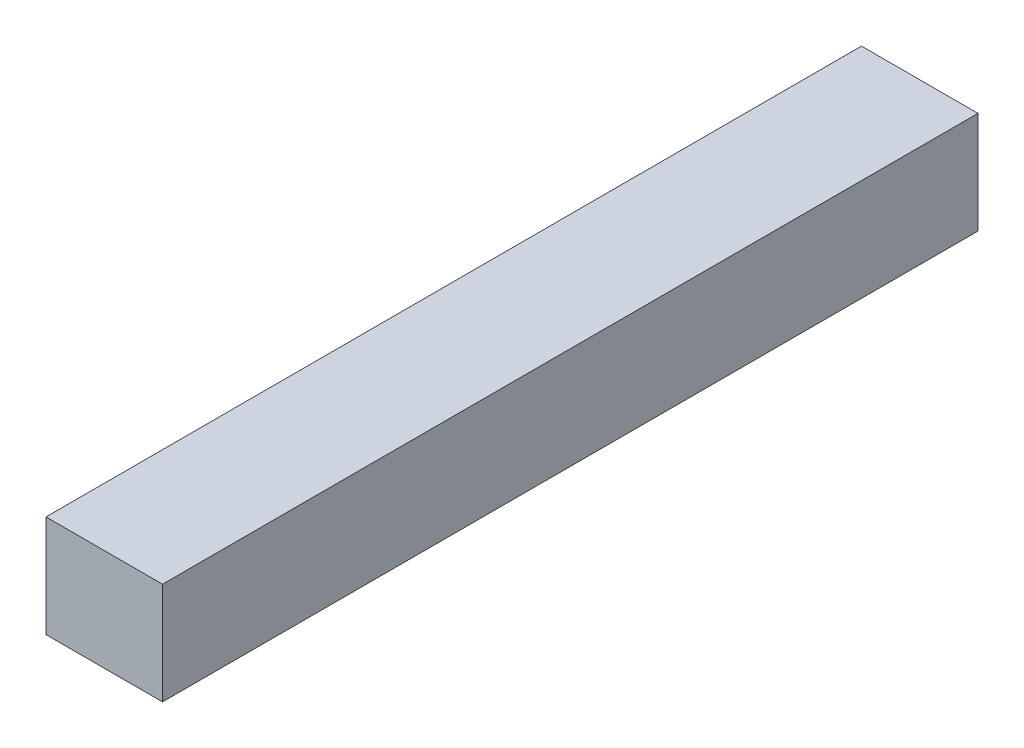
ISO-10303-21;
HEADER;
FILE_DESCRIPTION(('STEP AP214'),'2;1');
FILE_NAME('part.step','',(''),(''),'','','');
FILE_SCHEMA(('AUTOMOTIVE_DESIGN { 1 0 10303 214 1 1 1 1 }'));
ENDSEC;
DATA;
#1=APPLICATION_CONTEXT('core data for automotive mechanical design processes');
#2=APPLICATION_PROTOCOL_DEFINITION('international standard','automotive_design',2000,#1);
#3=PRODUCT_CONTEXT('',#1,'mechanical');
#4=PRODUCT('Part','Part','',(#3));
#5=PRODUCT_RELATED_PRODUCT_CATEGORY('part','',(#4));
#6=PRODUCT_DEFINITION_FORMATION('','',#4);
#7=PRODUCT_DEFINITION_CONTEXT('part definition',#1,'design');
#8=PRODUCT_DEFINITION('design','',#6,#7);
#9=PRODUCT_DEFINITION_SHAPE('','',#8);
#10=(LENGTH_UNIT() NAMED_UNIT(*) SI_UNIT(.MILLI.,.METRE.));
#11=(NAMED_UNIT(*) PLANE_ANGLE_UNIT() SI_UNIT($,.RADIAN.));
#12=(NAMED_UNIT(*) SI_UNIT($,.STERADIAN.) SOLID_ANGLE_UNIT());
#13=UNCERTAINTY_MEASURE_WITH_UNIT(LENGTH_MEASURE(1.E-05),#10,'distance_accuracy_value','');
#14=(GEOMETRIC_REPRESENTATION_CONTEXT(3) GLOBAL_UNCERTAINTY_ASSIGNED_CONTEXT((#13)) GLOBAL_UNIT_ASSIGNED_CONTEXT((#10,
#11,#12)) REPRESENTATION_CONTEXT('',''));
#15=CARTESIAN_POINT('',(0.,0.,0.));
#16=DIRECTION('',(0.,0.,1.));
#17=DIRECTION('',(1.,0.,0.));
#18=AXIS2_PLACEMENT_3D('',#15,#16,#17);
#19=CARTESIAN_POINT('',(4.,3.5,56.));
#20=DIRECTION('',(-1.,0.,0.));
#21=DIRECTION('',(0.,-1.,0.));
#22=AXIS2_PLACEMENT_3D('',#19,#20,#21);
#23=PLANE('',#22);
#24=DIRECTION('',(0.,1.,0.));
#25=VECTOR('',#24,1.);
#26=CARTESIAN_POINT('',(4.,3.5,0.));
#27=LINE('',#26,#25);
#28=CARTESIAN_POINT('',(4.,-3.5,0.));
#29=VERTEX_POINT('',#28);
#30=CARTESIAN_POINT('',(4.,3.5,0.));
#31=VERTEX_POINT('',#30);
#32=EDGE_CURVE('E96',#29,#31,#27,.T.);
#33=ORIENTED_EDGE('',*,*,#32,.T.);
#34=DIRECTION('',(0.,0.,-1.));
#35=VECTOR('',#34,1.);
#36=CARTESIAN_POINT('',(4.,3.5,56.));
#37=LINE('',#36,#35);
#38=CARTESIAN_POINT('',(4.,3.5,56.));
#39=VERTEX_POINT('',#38);
#40=EDGE_CURVE('E11',#39,#31,#37,.T.);
#41=ORIENTED_EDGE('',*,*,#40,.F.);
#42=DIRECTION('',(0.,1.,0.));
#43=VECTOR('',#42,1.);
#44=CARTESIAN_POINT('',(4.,3.5,56.));
#45=LINE('',#44,#43);
#46=CARTESIAN_POINT('',(4.,-3.5,56.));
#47=VERTEX_POINT('',#46);
#48=EDGE_CURVE('E84',#47,#39,#45,.T.);
#49=ORIENTED_EDGE('',*,*,#48,.F.);
#50=DIRECTION('',(0.,0.,-1.));
#51=VECTOR('',#50,1.);
#52=CARTESIAN_POINT('',(4.,-3.5,56.));
#53=LINE('',#52,#51);
#54=EDGE_CURVE('E92',#47,#29,#53,.T.);
#55=ORIENTED_EDGE('',*,*,#54,.T.);
#56=EDGE_LOOP('',(#33,#41,#49,#55));
#57=FACE_BOUND('',#56,.T.);
#58=ADVANCED_FACE('F33',(#57),#23,.F.);
#59=CARTESIAN_POINT('',(-4.,3.5,56.));
#60=DIRECTION('',(0.,-1.,0.));
#61=DIRECTION('',(0.,0.,-1.));
#62=AXIS2_PLACEMENT_3D('',#59,#60,#61);
#63=PLANE('',#62);
#64=DIRECTION('',(-1.,0.,0.));
#65=VECTOR('',#64,1.);
#66=CARTESIAN_POINT('',(-4.,3.5,0.));
#67=LINE('',#66,#65);
#68=CARTESIAN_POINT('',(-4.,3.5,0.));
#69=VERTEX_POINT('',#68);
#70=EDGE_CURVE('E88',#31,#69,#67,.T.);
#71=ORIENTED_EDGE('',*,*,#70,.T.);
#72=DIRECTION('',(0.,0.,-1.));
#73=VECTOR('',#72,1.);
#74=CARTESIAN_POINT('',(-4.,3.5,56.));
#75=LINE('',#74,#73);
#76=CARTESIAN_POINT('',(-4.,3.5,56.));
#77=VERTEX_POINT('',#76);
#78=EDGE_CURVE('E41',#77,#69,#75,.T.);
#79=ORIENTED_EDGE('',*,*,#78,.F.);
#80=DIRECTION('',(-1.,0.,0.));
#81=VECTOR('',#80,1.);
#82=CARTESIAN_POINT('',(-4.,3.5,56.));
#83=LINE('',#82,#81);
#84=EDGE_CURVE('E79',#39,#77,#83,.T.);
#85=ORIENTED_EDGE('',*,*,#84,.F.);
#86=ORIENTED_EDGE('',*,*,#40,.T.);
#87=EDGE_LOOP('',(#71,#79,#85,#86));
#88=FACE_BOUND('',#87,.T.);
#89=ADVANCED_FACE('F87',(#88),#63,.F.);
#90=CARTESIAN_POINT('',(-4.,3.5,56.));
#91=DIRECTION('',(1.,0.,0.));
#92=DIRECTION('',(0.,1.,0.));
#93=AXIS2_PLACEMENT_3D('',#90,#91,#92);
#94=PLANE('',#93);
#95=DIRECTION('',(0.,-1.,0.));
#96=VECTOR('',#95,1.);
#97=CARTESIAN_POINT('',(-4.,3.5,0.));
#98=LINE('',#97,#96);
#99=CARTESIAN_POINT('',(-4.,-3.5,0.));
#100=VERTEX_POINT('',#99);
#101=EDGE_CURVE('E66',#69,#100,#98,.T.);
#102=ORIENTED_EDGE('',*,*,#101,.T.);
#103=DIRECTION('',(0.,0.,-1.));
#104=VECTOR('',#103,1.);
#105=CARTESIAN_POINT('',(-4.,-3.5,56.));
#106=LINE('',#105,#104);
#107=CARTESIAN_POINT('',(-4.,-3.5,56.));
#108=VERTEX_POINT('',#107);
#109=EDGE_CURVE('E89',#108,#100,#106,.T.);
#110=ORIENTED_EDGE('',*,*,#109,.F.);
#111=DIRECTION('',(0.,-1.,0.));
#112=VECTOR('',#111,1.);
#113=CARTESIAN_POINT('',(-4.,3.5,56.));
#114=LINE('',#113,#112);
#115=EDGE_CURVE('E82',#77,#108,#114,.T.);
#116=ORIENTED_EDGE('',*,*,#115,.F.);
#117=ORIENTED_EDGE('',*,*,#78,.T.);
#118=EDGE_LOOP('',(#102,#110,#116,#117));
#119=FACE_BOUND('',#118,.T.);
#120=ADVANCED_FACE('F90',(#119),#94,.F.);
#121=CARTESIAN_POINT('',(-4.,-3.5,56.));
#122=DIRECTION('',(0.,1.,0.));
#123=DIRECTION('',(0.,0.,1.));
#124=AXIS2_PLACEMENT_3D('',#121,#122,#123);
#125=PLANE('',#124);
#126=DIRECTION('',(1.,0.,0.));
#127=VECTOR('',#126,1.);
#128=CARTESIAN_POINT('',(-4.,-3.5,0.));
#129=LINE('',#128,#127);
#130=EDGE_CURVE('E72',#100,#29,#129,.T.);
#131=ORIENTED_EDGE('',*,*,#130,.T.);
#132=ORIENTED_EDGE('',*,*,#54,.F.);
#133=DIRECTION('',(1.,0.,0.));
#134=VECTOR('',#133,1.);
#135=CARTESIAN_POINT('',(-4.,-3.5,56.));
#136=LINE('',#135,#134);
#137=EDGE_CURVE('E49',#108,#47,#136,.T.);
#138=ORIENTED_EDGE('',*,*,#137,.F.);
#139=ORIENTED_EDGE('',*,*,#109,.T.);
#140=EDGE_LOOP('',(#131,#132,#138,#139));
#141=FACE_BOUND('',#140,.T.);
#142=ADVANCED_FACE('F103',(#141),#125,.F.);
#143=CARTESIAN_POINT('',(0.,0.,56.));
#144=DIRECTION('',(0.,0.,1.));
#145=DIRECTION('',(1.,0.,0.));
#146=AXIS2_PLACEMENT_3D('',#143,#144,#145);
#147=PLANE('',#146);
#148=ORIENTED_EDGE('',*,*,#48,.T.);
#149=ORIENTED_EDGE('',*,*,#84,.T.);
#150=ORIENTED_EDGE('',*,*,#115,.T.);
#151=ORIENTED_EDGE('',*,*,#137,.T.);
#152=EDGE_LOOP('',(#148,#149,#150,#151));
#153=FACE_BOUND('',#152,.T.);
#154=ADVANCED_FACE('F80',(#153),#147,.T.);
#155=CARTESIAN_POINT('',(0.,0.,0.));
#156=DIRECTION('',(0.,0.,1.));
#157=DIRECTION('',(1.,0.,0.));
#158=AXIS2_PLACEMENT_3D('',#155,#156,#157);
#159=PLANE('',#158);
#160=ORIENTED_EDGE('',*,*,#32,.F.);
#161=ORIENTED_EDGE('',*,*,#130,.F.);
#162=ORIENTED_EDGE('',*,*,#101,.F.);
#163=ORIENTED_EDGE('',*,*,#70,.F.);
#164=EDGE_LOOP('',(#160,#161,#162,#163));
#165=FACE_BOUND('',#164,.T.);
#166=ADVANCED_FACE('F106',(#165),#159,.F.);
#167=CLOSED_SHELL('',(#58,#89,#120,#142,#154,#166));
#168=MANIFOLD_SOLID_BREP('B2',#167);
#169=ADVANCED_BREP_SHAPE_REPRESENTATION('',(#18,#168),#14);
#170=SHAPE_DEFINITION_REPRESENTATION(#9,#169);
ENDSEC;
END-ISO-10303-21;
